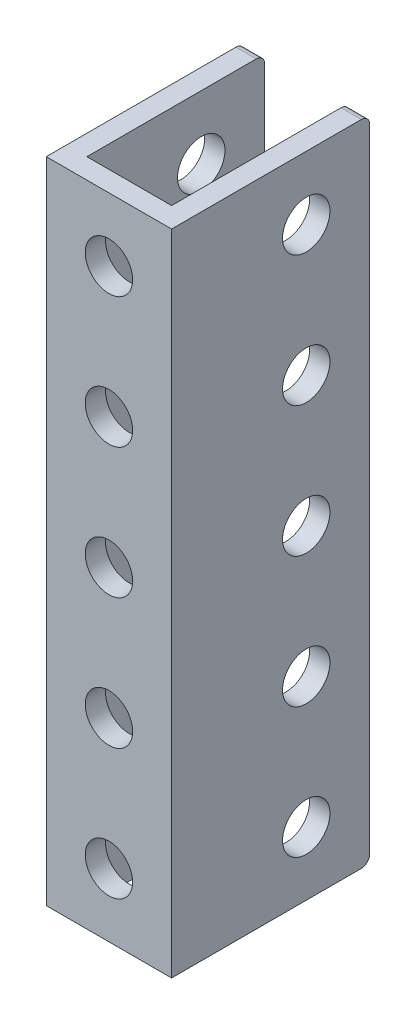
ISO-10303-21;
HEADER;
FILE_DESCRIPTION(('STEP AP214'),'2;1');
FILE_NAME('part.step','',(''),(''),'','','');
FILE_SCHEMA(('AUTOMOTIVE_DESIGN { 1 0 10303 214 1 1 1 1 }'));
ENDSEC;
DATA;
#1=APPLICATION_CONTEXT('core data for automotive mechanical design processes');
#2=APPLICATION_PROTOCOL_DEFINITION('international standard','automotive_design',2000,#1);
#3=PRODUCT_CONTEXT('',#1,'mechanical');
#4=PRODUCT('Part','Part','',(#3));
#5=PRODUCT_RELATED_PRODUCT_CATEGORY('part','',(#4));
#6=PRODUCT_DEFINITION_FORMATION('','',#4);
#7=PRODUCT_DEFINITION_CONTEXT('part definition',#1,'design');
#8=PRODUCT_DEFINITION('design','',#6,#7);
#9=PRODUCT_DEFINITION_SHAPE('','',#8);
#10=(LENGTH_UNIT() NAMED_UNIT(*) SI_UNIT(.MILLI.,.METRE.));
#11=(NAMED_UNIT(*) PLANE_ANGLE_UNIT() SI_UNIT($,.RADIAN.));
#12=(NAMED_UNIT(*) SI_UNIT($,.STERADIAN.) SOLID_ANGLE_UNIT());
#13=UNCERTAINTY_MEASURE_WITH_UNIT(LENGTH_MEASURE(1.E-05),#10,'distance_accuracy_value','');
#14=(GEOMETRIC_REPRESENTATION_CONTEXT(3) GLOBAL_UNCERTAINTY_ASSIGNED_CONTEXT((#13)) GLOBAL_UNIT_ASSIGNED_CONTEXT((#10,
#11,#12)) REPRESENTATION_CONTEXT('',''));
#15=CARTESIAN_POINT('',(0.,0.,0.));
#16=DIRECTION('',(0.,0.,1.));
#17=DIRECTION('',(1.,0.,0.));
#18=AXIS2_PLACEMENT_3D('',#15,#16,#17);
#19=CARTESIAN_POINT('',(4.699,48.641,-13.335));
#20=DIRECTION('',(0.,0.,-1.));
#21=DIRECTION('',(-1.,0.,0.));
#22=AXIS2_PLACEMENT_3D('',#19,#20,#21);
#23=PLANE('',#22);
#24=DIRECTION('',(0.,-1.,0.));
#25=VECTOR('',#24,1.);
#26=CARTESIAN_POINT('',(-4.699,48.641,-13.335));
#27=LINE('',#26,#25);
#28=CARTESIAN_POINT('',(-4.699,48.006,-13.335));
#29=VERTEX_POINT('',#28);
#30=CARTESIAN_POINT('',(-4.699,0.635000000000018,-13.335));
#31=VERTEX_POINT('',#30);
#32=EDGE_CURVE('E177',#29,#31,#27,.T.);
#33=ORIENTED_EDGE('',*,*,#32,.F.);
#34=DIRECTION('',(-1.,0.,0.));
#35=VECTOR('',#34,1.);
#36=CARTESIAN_POINT('',(4.699,48.006,-13.335));
#37=LINE('',#36,#35);
#38=CARTESIAN_POINT('',(-3.175,48.006,-13.335));
#39=VERTEX_POINT('',#38);
#40=EDGE_CURVE('E54',#29,#39,#37,.F.);
#41=ORIENTED_EDGE('',*,*,#40,.T.);
#42=DIRECTION('',(0.,-1.,0.));
#43=VECTOR('',#42,1.);
#44=CARTESIAN_POINT('',(-3.175,48.641,-13.335));
#45=LINE('',#44,#43);
#46=CARTESIAN_POINT('',(-3.175,0.635000000000018,-13.335));
#47=VERTEX_POINT('',#46);
#48=EDGE_CURVE('E149',#39,#47,#45,.T.);
#49=ORIENTED_EDGE('',*,*,#48,.T.);
#50=DIRECTION('',(-1.,0.,0.));
#51=VECTOR('',#50,1.);
#52=CARTESIAN_POINT('',(4.699,0.635000000000004,-13.335));
#53=LINE('',#52,#51);
#54=EDGE_CURVE('E213',#47,#31,#53,.T.);
#55=ORIENTED_EDGE('',*,*,#54,.T.);
#56=EDGE_LOOP('',(#33,#41,#49,#55));
#57=FACE_BOUND('',#56,.T.);
#58=ADVANCED_FACE('F33',(#57),#23,.T.);
#59=CARTESIAN_POINT('',(4.699,48.641,1.524));
#60=DIRECTION('',(0.,1.,0.));
#61=DIRECTION('',(0.,0.,1.));
#62=AXIS2_PLACEMENT_3D('',#59,#60,#61);
#63=PLANE('',#62);
#64=DIRECTION('',(0.,0.,-1.));
#65=VECTOR('',#64,1.);
#66=CARTESIAN_POINT('',(4.699,48.641,1.524));
#67=LINE('',#66,#65);
#68=CARTESIAN_POINT('',(4.699,48.641,1.524));
#69=VERTEX_POINT('',#68);
#70=CARTESIAN_POINT('',(4.699,48.641,-12.7));
#71=VERTEX_POINT('',#70);
#72=EDGE_CURVE('E163',#69,#71,#67,.T.);
#73=ORIENTED_EDGE('',*,*,#72,.T.);
#74=DIRECTION('',(-1.,0.,0.));
#75=VECTOR('',#74,1.);
#76=CARTESIAN_POINT('',(4.699,48.641,-12.7));
#77=LINE('',#76,#75);
#78=CARTESIAN_POINT('',(3.175,48.641,-12.7));
#79=VERTEX_POINT('',#78);
#80=EDGE_CURVE('E131',#71,#79,#77,.T.);
#81=ORIENTED_EDGE('',*,*,#80,.T.);
#82=DIRECTION('',(0.,0.,1.));
#83=VECTOR('',#82,1.);
#84=CARTESIAN_POINT('',(3.175,48.641,-13.335));
#85=LINE('',#84,#83);
#86=CARTESIAN_POINT('',(3.175,48.641,0.));
#87=VERTEX_POINT('',#86);
#88=EDGE_CURVE('E123',#79,#87,#85,.T.);
#89=ORIENTED_EDGE('',*,*,#88,.T.);
#90=DIRECTION('',(-1.,0.,0.));
#91=VECTOR('',#90,1.);
#92=CARTESIAN_POINT('',(3.175,48.641,0.));
#93=LINE('',#92,#91);
#94=CARTESIAN_POINT('',(-3.175,48.641,0.));
#95=VERTEX_POINT('',#94);
#96=EDGE_CURVE('E129',#87,#95,#93,.T.);
#97=ORIENTED_EDGE('',*,*,#96,.T.);
#98=DIRECTION('',(0.,0.,-1.));
#99=VECTOR('',#98,1.);
#100=CARTESIAN_POINT('',(-3.175,48.641,0.));
#101=LINE('',#100,#99);
#102=CARTESIAN_POINT('',(-3.175,48.641,-12.7));
#103=VERTEX_POINT('',#102);
#104=EDGE_CURVE('E133',#95,#103,#101,.T.);
#105=ORIENTED_EDGE('',*,*,#104,.T.);
#106=DIRECTION('',(-1.,0.,0.));
#107=VECTOR('',#106,1.);
#108=CARTESIAN_POINT('',(4.699,48.641,-12.7));
#109=LINE('',#108,#107);
#110=CARTESIAN_POINT('',(-4.699,48.641,-12.7));
#111=VERTEX_POINT('',#110);
#112=EDGE_CURVE('E205',#103,#111,#109,.T.);
#113=ORIENTED_EDGE('',*,*,#112,.T.);
#114=DIRECTION('',(0.,0.,-1.));
#115=VECTOR('',#114,1.);
#116=CARTESIAN_POINT('',(-4.699,48.641,1.524));
#117=LINE('',#116,#115);
#118=CARTESIAN_POINT('',(-4.699,48.641,1.524));
#119=VERTEX_POINT('',#118);
#120=EDGE_CURVE('E160',#119,#111,#117,.T.);
#121=ORIENTED_EDGE('',*,*,#120,.F.);
#122=DIRECTION('',(-1.,0.,0.));
#123=VECTOR('',#122,1.);
#124=CARTESIAN_POINT('',(4.699,48.641,1.524));
#125=LINE('',#124,#123);
#126=EDGE_CURVE('E184',#69,#119,#125,.T.);
#127=ORIENTED_EDGE('',*,*,#126,.F.);
#128=EDGE_LOOP('',(#73,#81,#89,#97,#105,#113,#121,#127));
#129=FACE_BOUND('',#128,.T.);
#130=ADVANCED_FACE('F126',(#129),#63,.T.);
#131=CARTESIAN_POINT('',(4.699,0.,1.524));
#132=DIRECTION('',(0.,0.,1.));
#133=DIRECTION('',(1.,0.,0.));
#134=AXIS2_PLACEMENT_3D('',#131,#132,#133);
#135=PLANE('',#134);
#136=CARTESIAN_POINT('',(0.,34.0995,1.524));
#137=DIRECTION('',(0.,0.,1.));
#138=DIRECTION('',(1.,0.,0.));
#139=AXIS2_PLACEMENT_3D('',#136,#137,#138);
#140=CIRCLE('',#139,1.77799999999998);
#141=CARTESIAN_POINT('',(1.77799999999998,34.0995,1.524));
#142=VERTEX_POINT('',#141);
#143=EDGE_CURVE('E283',#142,#142,#140,.T.);
#144=ORIENTED_EDGE('',*,*,#143,.F.);
#145=EDGE_LOOP('',(#144));
#146=FACE_BOUND('',#145,.T.);
#147=CARTESIAN_POINT('',(0.,43.8785,1.524));
#148=DIRECTION('',(0.,0.,1.));
#149=DIRECTION('',(1.,0.,0.));
#150=AXIS2_PLACEMENT_3D('',#147,#148,#149);
#151=CIRCLE('',#150,1.77799999999998);
#152=CARTESIAN_POINT('',(1.77799999999998,43.8785,1.524));
#153=VERTEX_POINT('',#152);
#154=EDGE_CURVE('E277',#153,#153,#151,.T.);
#155=ORIENTED_EDGE('',*,*,#154,.F.);
#156=EDGE_LOOP('',(#155));
#157=FACE_BOUND('',#156,.T.);
#158=CARTESIAN_POINT('',(0.,24.3205,1.524));
#159=DIRECTION('',(0.,0.,1.));
#160=DIRECTION('',(1.,0.,0.));
#161=AXIS2_PLACEMENT_3D('',#158,#159,#160);
#162=CIRCLE('',#161,1.77799999999998);
#163=CARTESIAN_POINT('',(1.77799999999998,24.3205,1.524));
#164=VERTEX_POINT('',#163);
#165=EDGE_CURVE('E271',#164,#164,#162,.T.);
#166=ORIENTED_EDGE('',*,*,#165,.F.);
#167=EDGE_LOOP('',(#166));
#168=FACE_BOUND('',#167,.T.);
#169=CARTESIAN_POINT('',(0.,14.5415,1.524));
#170=DIRECTION('',(0.,0.,1.));
#171=DIRECTION('',(1.,0.,0.));
#172=AXIS2_PLACEMENT_3D('',#169,#170,#171);
#173=CIRCLE('',#172,1.77799999999998);
#174=CARTESIAN_POINT('',(1.77799999999998,14.5415,1.524));
#175=VERTEX_POINT('',#174);
#176=EDGE_CURVE('E265',#175,#175,#173,.T.);
#177=ORIENTED_EDGE('',*,*,#176,.F.);
#178=EDGE_LOOP('',(#177));
#179=FACE_BOUND('',#178,.T.);
#180=CARTESIAN_POINT('',(0.,4.76249999999999,1.524));
#181=DIRECTION('',(0.,0.,1.));
#182=DIRECTION('',(1.,0.,0.));
#183=AXIS2_PLACEMENT_3D('',#180,#181,#182);
#184=CIRCLE('',#183,1.77799999999998);
#185=CARTESIAN_POINT('',(1.77799999999998,4.76249999999999,1.524));
#186=VERTEX_POINT('',#185);
#187=EDGE_CURVE('E259',#186,#186,#184,.T.);
#188=ORIENTED_EDGE('',*,*,#187,.F.);
#189=EDGE_LOOP('',(#188));
#190=FACE_BOUND('',#189,.T.);
#191=DIRECTION('',(0.,1.,0.));
#192=VECTOR('',#191,1.);
#193=CARTESIAN_POINT('',(-4.699,0.,1.524));
#194=LINE('',#193,#192);
#195=CARTESIAN_POINT('',(-4.699,0.,1.524));
#196=VERTEX_POINT('',#195);
#197=EDGE_CURVE('E166',#196,#119,#194,.T.);
#198=ORIENTED_EDGE('',*,*,#197,.F.);
#199=DIRECTION('',(-1.,0.,0.));
#200=VECTOR('',#199,1.);
#201=CARTESIAN_POINT('',(4.699,0.,1.524));
#202=LINE('',#201,#200);
#203=CARTESIAN_POINT('',(4.699,0.,1.524));
#204=VERTEX_POINT('',#203);
#205=EDGE_CURVE('E174',#204,#196,#202,.T.);
#206=ORIENTED_EDGE('',*,*,#205,.F.);
#207=DIRECTION('',(0.,1.,0.));
#208=VECTOR('',#207,1.);
#209=CARTESIAN_POINT('',(4.699,0.,1.524));
#210=LINE('',#209,#208);
#211=EDGE_CURVE('E171',#204,#69,#210,.T.);
#212=ORIENTED_EDGE('',*,*,#211,.T.);
#213=ORIENTED_EDGE('',*,*,#126,.T.);
#214=EDGE_LOOP('',(#198,#206,#212,#213));
#215=FACE_BOUND('',#214,.T.);
#216=ADVANCED_FACE('F354',(#146,#157,#168,#179,#190,#215),#135,.T.);
#217=CARTESIAN_POINT('',(4.699,0.,-13.335));
#218=DIRECTION('',(0.,-1.,0.));
#219=DIRECTION('',(0.,0.,-1.));
#220=AXIS2_PLACEMENT_3D('',#217,#218,#219);
#221=PLANE('',#220);
#222=DIRECTION('',(0.,0.,1.));
#223=VECTOR('',#222,1.);
#224=CARTESIAN_POINT('',(3.175,0.,-13.335));
#225=LINE('',#224,#223);
#226=CARTESIAN_POINT('',(3.175,0.,-12.7));
#227=VERTEX_POINT('',#226);
#228=CARTESIAN_POINT('',(3.175,0.,0.));
#229=VERTEX_POINT('',#228);
#230=EDGE_CURVE('E140',#227,#229,#225,.T.);
#231=ORIENTED_EDGE('',*,*,#230,.F.);
#232=DIRECTION('',(-1.,0.,0.));
#233=VECTOR('',#232,1.);
#234=CARTESIAN_POINT('',(4.699,0.,-12.7));
#235=LINE('',#234,#233);
#236=CARTESIAN_POINT('',(4.699,0.,-12.7));
#237=VERTEX_POINT('',#236);
#238=EDGE_CURVE('E199',#227,#237,#235,.F.);
#239=ORIENTED_EDGE('',*,*,#238,.T.);
#240=DIRECTION('',(0.,0.,1.));
#241=VECTOR('',#240,1.);
#242=CARTESIAN_POINT('',(4.699,0.,-13.335));
#243=LINE('',#242,#241);
#244=EDGE_CURVE('E169',#237,#204,#243,.T.);
#245=ORIENTED_EDGE('',*,*,#244,.T.);
#246=ORIENTED_EDGE('',*,*,#205,.T.);
#247=DIRECTION('',(0.,0.,1.));
#248=VECTOR('',#247,1.);
#249=CARTESIAN_POINT('',(-4.699,0.,-13.335));
#250=LINE('',#249,#248);
#251=CARTESIAN_POINT('',(-4.699,0.,-12.7));
#252=VERTEX_POINT('',#251);
#253=EDGE_CURVE('E180',#252,#196,#250,.T.);
#254=ORIENTED_EDGE('',*,*,#253,.F.);
#255=DIRECTION('',(-1.,0.,0.));
#256=VECTOR('',#255,1.);
#257=CARTESIAN_POINT('',(4.699,0.,-12.7));
#258=LINE('',#257,#256);
#259=CARTESIAN_POINT('',(-3.175,0.,-12.7));
#260=VERTEX_POINT('',#259);
#261=EDGE_CURVE('E197',#252,#260,#258,.F.);
#262=ORIENTED_EDGE('',*,*,#261,.T.);
#263=DIRECTION('',(0.,0.,-1.));
#264=VECTOR('',#263,1.);
#265=CARTESIAN_POINT('',(-3.175,0.,0.));
#266=LINE('',#265,#264);
#267=CARTESIAN_POINT('',(-3.175,0.,0.));
#268=VERTEX_POINT('',#267);
#269=EDGE_CURVE('E154',#268,#260,#266,.T.);
#270=ORIENTED_EDGE('',*,*,#269,.F.);
#271=DIRECTION('',(-1.,0.,0.));
#272=VECTOR('',#271,1.);
#273=CARTESIAN_POINT('',(3.175,0.,0.));
#274=LINE('',#273,#272);
#275=EDGE_CURVE('E158',#229,#268,#274,.T.);
#276=ORIENTED_EDGE('',*,*,#275,.F.);
#277=EDGE_LOOP('',(#231,#239,#245,#246,#254,#262,#270,#276));
#278=FACE_BOUND('',#277,.T.);
#279=ADVANCED_FACE('F359',(#278),#221,.T.);
#280=DIRECTION('',(0.,-1.,0.));
#281=VECTOR('',#280,1.);
#282=CARTESIAN_POINT('',(4.699,48.641,-13.335));
#283=LINE('',#282,#281);
#284=CARTESIAN_POINT('',(4.699,48.006,-13.335));
#285=VERTEX_POINT('',#284);
#286=CARTESIAN_POINT('',(4.699,0.635000000000018,-13.335));
#287=VERTEX_POINT('',#286);
#288=EDGE_CURVE('E165',#285,#287,#283,.T.);
#289=ORIENTED_EDGE('',*,*,#288,.T.);
#290=DIRECTION('',(-1.,0.,0.));
#291=VECTOR('',#290,1.);
#292=CARTESIAN_POINT('',(4.699,0.635000000000004,-13.335));
#293=LINE('',#292,#291);
#294=CARTESIAN_POINT('',(3.175,0.635000000000018,-13.335));
#295=VERTEX_POINT('',#294);
#296=EDGE_CURVE('E190',#287,#295,#293,.T.);
#297=ORIENTED_EDGE('',*,*,#296,.T.);
#298=DIRECTION('',(0.,-1.,0.));
#299=VECTOR('',#298,1.);
#300=CARTESIAN_POINT('',(3.175,48.641,-13.335));
#301=LINE('',#300,#299);
#302=CARTESIAN_POINT('',(3.175,48.006,-13.335));
#303=VERTEX_POINT('',#302);
#304=EDGE_CURVE('E145',#303,#295,#301,.T.);
#305=ORIENTED_EDGE('',*,*,#304,.F.);
#306=DIRECTION('',(-1.,0.,0.));
#307=VECTOR('',#306,1.);
#308=CARTESIAN_POINT('',(4.699,48.006,-13.335));
#309=LINE('',#308,#307);
#310=EDGE_CURVE('E186',#303,#285,#309,.F.);
#311=ORIENTED_EDGE('',*,*,#310,.T.);
#312=EDGE_LOOP('',(#289,#297,#305,#311));
#313=FACE_BOUND('',#312,.T.);
#314=ADVANCED_FACE('F350',(#313),#23,.T.);
#315=CARTESIAN_POINT('',(4.699,0.,0.));
#316=DIRECTION('',(-1.,0.,0.));
#317=DIRECTION('',(0.,0.,1.));
#318=AXIS2_PLACEMENT_3D('',#315,#316,#317);
#319=PLANE('',#318);
#320=CARTESIAN_POINT('',(4.699,34.0995,-8.5725));
#321=DIRECTION('',(1.,0.,0.));
#322=DIRECTION('',(0.,0.,-1.));
#323=AXIS2_PLACEMENT_3D('',#320,#321,#322);
#324=CIRCLE('',#323,1.77799999999998);
#325=CARTESIAN_POINT('',(4.699,34.0995,-10.3505));
#326=VERTEX_POINT('',#325);
#327=EDGE_CURVE('E253',#326,#326,#324,.T.);
#328=ORIENTED_EDGE('',*,*,#327,.F.);
#329=EDGE_LOOP('',(#328));
#330=FACE_BOUND('',#329,.T.);
#331=CARTESIAN_POINT('',(4.699,43.8785,-8.5725));
#332=DIRECTION('',(1.,0.,0.));
#333=DIRECTION('',(0.,0.,-1.));
#334=AXIS2_PLACEMENT_3D('',#331,#332,#333);
#335=CIRCLE('',#334,1.77799999999998);
#336=CARTESIAN_POINT('',(4.699,43.8785,-10.3505));
#337=VERTEX_POINT('',#336);
#338=EDGE_CURVE('E247',#337,#337,#335,.T.);
#339=ORIENTED_EDGE('',*,*,#338,.F.);
#340=EDGE_LOOP('',(#339));
#341=FACE_BOUND('',#340,.T.);
#342=CARTESIAN_POINT('',(4.699,24.3205,-8.5725));
#343=DIRECTION('',(1.,0.,0.));
#344=DIRECTION('',(0.,0.,-1.));
#345=AXIS2_PLACEMENT_3D('',#342,#343,#344);
#346=CIRCLE('',#345,1.77799999999998);
#347=CARTESIAN_POINT('',(4.699,24.3205,-10.3505));
#348=VERTEX_POINT('',#347);
#349=EDGE_CURVE('E241',#348,#348,#346,.T.);
#350=ORIENTED_EDGE('',*,*,#349,.F.);
#351=EDGE_LOOP('',(#350));
#352=FACE_BOUND('',#351,.T.);
#353=CARTESIAN_POINT('',(4.699,14.5415,-8.5725));
#354=DIRECTION('',(1.,0.,0.));
#355=DIRECTION('',(0.,0.,-1.));
#356=AXIS2_PLACEMENT_3D('',#353,#354,#355);
#357=CIRCLE('',#356,1.77799999999998);
#358=CARTESIAN_POINT('',(4.699,14.5415,-10.3505));
#359=VERTEX_POINT('',#358);
#360=EDGE_CURVE('E235',#359,#359,#357,.T.);
#361=ORIENTED_EDGE('',*,*,#360,.F.);
#362=EDGE_LOOP('',(#361));
#363=FACE_BOUND('',#362,.T.);
#364=CARTESIAN_POINT('',(4.699,4.76249999999999,-8.5725));
#365=DIRECTION('',(1.,0.,0.));
#366=DIRECTION('',(0.,0.,-1.));
#367=AXIS2_PLACEMENT_3D('',#364,#365,#366);
#368=CIRCLE('',#367,1.77799999999998);
#369=CARTESIAN_POINT('',(4.699,4.76249999999999,-10.3505));
#370=VERTEX_POINT('',#369);
#371=EDGE_CURVE('E229',#370,#370,#368,.T.);
#372=ORIENTED_EDGE('',*,*,#371,.F.);
#373=EDGE_LOOP('',(#372));
#374=FACE_BOUND('',#373,.T.);
#375=ORIENTED_EDGE('',*,*,#244,.F.);
#376=CARTESIAN_POINT('',(4.699,0.635000000000004,-12.7));
#377=DIRECTION('',(-1.,0.,0.));
#378=DIRECTION('',(0.,0.,1.));
#379=AXIS2_PLACEMENT_3D('',#376,#377,#378);
#380=CIRCLE('',#379,0.635);
#381=EDGE_CURVE('E203',#237,#287,#380,.F.);
#382=ORIENTED_EDGE('',*,*,#381,.T.);
#383=ORIENTED_EDGE('',*,*,#288,.F.);
#384=CARTESIAN_POINT('',(4.699,48.006,-12.7));
#385=DIRECTION('',(-1.,0.,0.));
#386=DIRECTION('',(0.,0.,1.));
#387=AXIS2_PLACEMENT_3D('',#384,#385,#386);
#388=CIRCLE('',#387,0.635);
#389=EDGE_CURVE('E201',#285,#71,#388,.F.);
#390=ORIENTED_EDGE('',*,*,#389,.T.);
#391=ORIENTED_EDGE('',*,*,#72,.F.);
#392=ORIENTED_EDGE('',*,*,#211,.F.);
#393=EDGE_LOOP('',(#375,#382,#383,#390,#391,#392));
#394=FACE_BOUND('',#393,.T.);
#395=ADVANCED_FACE('F358',(#330,#341,#352,#363,#374,#394),#319,.F.);
#396=CARTESIAN_POINT('',(-4.699,0.,0.));
#397=DIRECTION('',(-1.,0.,0.));
#398=DIRECTION('',(0.,0.,1.));
#399=AXIS2_PLACEMENT_3D('',#396,#397,#398);
#400=PLANE('',#399);
#401=CARTESIAN_POINT('',(-4.69900000000001,34.0995,-8.5725));
#402=DIRECTION('',(1.,0.,0.));
#403=DIRECTION('',(0.,0.,-1.));
#404=AXIS2_PLACEMENT_3D('',#401,#402,#403);
#405=CIRCLE('',#404,1.77799999999998);
#406=CARTESIAN_POINT('',(-4.69900000000001,34.0995,-10.3505));
#407=VERTEX_POINT('',#406);
#408=EDGE_CURVE('E310',#407,#407,#405,.T.);
#409=ORIENTED_EDGE('',*,*,#408,.T.);
#410=EDGE_LOOP('',(#409));
#411=FACE_BOUND('',#410,.T.);
#412=CARTESIAN_POINT('',(-4.69900000000001,43.8785,-8.5725));
#413=DIRECTION('',(1.,0.,0.));
#414=DIRECTION('',(0.,0.,-1.));
#415=AXIS2_PLACEMENT_3D('',#412,#413,#414);
#416=CIRCLE('',#415,1.77799999999998);
#417=CARTESIAN_POINT('',(-4.69900000000001,43.8785,-10.3505));
#418=VERTEX_POINT('',#417);
#419=EDGE_CURVE('E304',#418,#418,#416,.T.);
#420=ORIENTED_EDGE('',*,*,#419,.T.);
#421=EDGE_LOOP('',(#420));
#422=FACE_BOUND('',#421,.T.);
#423=CARTESIAN_POINT('',(-4.69900000000001,24.3205,-8.5725));
#424=DIRECTION('',(1.,0.,0.));
#425=DIRECTION('',(0.,0.,-1.));
#426=AXIS2_PLACEMENT_3D('',#423,#424,#425);
#427=CIRCLE('',#426,1.77799999999998);
#428=CARTESIAN_POINT('',(-4.69900000000001,24.3205,-10.3505));
#429=VERTEX_POINT('',#428);
#430=EDGE_CURVE('E298',#429,#429,#427,.T.);
#431=ORIENTED_EDGE('',*,*,#430,.T.);
#432=EDGE_LOOP('',(#431));
#433=FACE_BOUND('',#432,.T.);
#434=CARTESIAN_POINT('',(-4.69900000000001,14.5415,-8.5725));
#435=DIRECTION('',(1.,0.,0.));
#436=DIRECTION('',(0.,0.,-1.));
#437=AXIS2_PLACEMENT_3D('',#434,#435,#436);
#438=CIRCLE('',#437,1.77799999999998);
#439=CARTESIAN_POINT('',(-4.69900000000001,14.5415,-10.3505));
#440=VERTEX_POINT('',#439);
#441=EDGE_CURVE('E292',#440,#440,#438,.T.);
#442=ORIENTED_EDGE('',*,*,#441,.T.);
#443=EDGE_LOOP('',(#442));
#444=FACE_BOUND('',#443,.T.);
#445=CARTESIAN_POINT('',(-4.69900000000001,4.76249999999999,-8.5725));
#446=DIRECTION('',(1.,0.,0.));
#447=DIRECTION('',(0.,0.,-1.));
#448=AXIS2_PLACEMENT_3D('',#445,#446,#447);
#449=CIRCLE('',#448,1.77799999999998);
#450=CARTESIAN_POINT('',(-4.69900000000001,4.76249999999999,-10.3505));
#451=VERTEX_POINT('',#450);
#452=EDGE_CURVE('E286',#451,#451,#449,.T.);
#453=ORIENTED_EDGE('',*,*,#452,.T.);
#454=EDGE_LOOP('',(#453));
#455=FACE_BOUND('',#454,.T.);
#456=ORIENTED_EDGE('',*,*,#120,.T.);
#457=CARTESIAN_POINT('',(-4.699,48.006,-12.7));
#458=DIRECTION('',(-1.,0.,0.));
#459=DIRECTION('',(0.,0.,1.));
#460=AXIS2_PLACEMENT_3D('',#457,#458,#459);
#461=CIRCLE('',#460,0.635);
#462=EDGE_CURVE('E211',#111,#29,#461,.T.);
#463=ORIENTED_EDGE('',*,*,#462,.T.);
#464=ORIENTED_EDGE('',*,*,#32,.T.);
#465=CARTESIAN_POINT('',(-4.699,0.635000000000004,-12.7));
#466=DIRECTION('',(-1.,0.,0.));
#467=DIRECTION('',(0.,0.,1.));
#468=AXIS2_PLACEMENT_3D('',#465,#466,#467);
#469=CIRCLE('',#468,0.635);
#470=EDGE_CURVE('E209',#31,#252,#469,.T.);
#471=ORIENTED_EDGE('',*,*,#470,.T.);
#472=ORIENTED_EDGE('',*,*,#253,.T.);
#473=ORIENTED_EDGE('',*,*,#197,.T.);
#474=EDGE_LOOP('',(#456,#463,#464,#471,#472,#473));
#475=FACE_BOUND('',#474,.T.);
#476=ADVANCED_FACE('F219',(#411,#422,#433,#444,#455,#475),#400,.T.);
#477=CARTESIAN_POINT('',(-3.175,48.641,0.));
#478=DIRECTION('',(-1.,0.,0.));
#479=DIRECTION('',(0.,0.,1.));
#480=AXIS2_PLACEMENT_3D('',#477,#478,#479);
#481=PLANE('',#480);
#482=CARTESIAN_POINT('',(-3.175,34.0995,-8.5725));
#483=DIRECTION('',(1.,0.,0.));
#484=DIRECTION('',(0.,0.,-1.));
#485=AXIS2_PLACEMENT_3D('',#482,#483,#484);
#486=CIRCLE('',#485,1.77799999999998);
#487=CARTESIAN_POINT('',(-3.175,34.0995,-10.3505));
#488=VERTEX_POINT('',#487);
#489=EDGE_CURVE('E313',#488,#488,#486,.T.);
#490=ORIENTED_EDGE('',*,*,#489,.F.);
#491=EDGE_LOOP('',(#490));
#492=FACE_BOUND('',#491,.T.);
#493=CARTESIAN_POINT('',(-3.175,43.8785,-8.5725));
#494=DIRECTION('',(1.,0.,0.));
#495=DIRECTION('',(0.,0.,-1.));
#496=AXIS2_PLACEMENT_3D('',#493,#494,#495);
#497=CIRCLE('',#496,1.77799999999998);
#498=CARTESIAN_POINT('',(-3.175,43.8785,-10.3505));
#499=VERTEX_POINT('',#498);
#500=EDGE_CURVE('E307',#499,#499,#497,.T.);
#501=ORIENTED_EDGE('',*,*,#500,.F.);
#502=EDGE_LOOP('',(#501));
#503=FACE_BOUND('',#502,.T.);
#504=CARTESIAN_POINT('',(-3.175,24.3205,-8.5725));
#505=DIRECTION('',(1.,0.,0.));
#506=DIRECTION('',(0.,0.,-1.));
#507=AXIS2_PLACEMENT_3D('',#504,#505,#506);
#508=CIRCLE('',#507,1.77799999999998);
#509=CARTESIAN_POINT('',(-3.175,24.3205,-10.3505));
#510=VERTEX_POINT('',#509);
#511=EDGE_CURVE('E301',#510,#510,#508,.T.);
#512=ORIENTED_EDGE('',*,*,#511,.F.);
#513=EDGE_LOOP('',(#512));
#514=FACE_BOUND('',#513,.T.);
#515=CARTESIAN_POINT('',(-3.175,14.5415,-8.5725));
#516=DIRECTION('',(1.,0.,0.));
#517=DIRECTION('',(0.,0.,-1.));
#518=AXIS2_PLACEMENT_3D('',#515,#516,#517);
#519=CIRCLE('',#518,1.77799999999998);
#520=CARTESIAN_POINT('',(-3.175,14.5415,-10.3505));
#521=VERTEX_POINT('',#520);
#522=EDGE_CURVE('E295',#521,#521,#519,.T.);
#523=ORIENTED_EDGE('',*,*,#522,.F.);
#524=EDGE_LOOP('',(#523));
#525=FACE_BOUND('',#524,.T.);
#526=CARTESIAN_POINT('',(-3.175,4.76249999999999,-8.5725));
#527=DIRECTION('',(1.,0.,0.));
#528=DIRECTION('',(0.,0.,-1.));
#529=AXIS2_PLACEMENT_3D('',#526,#527,#528);
#530=CIRCLE('',#529,1.77799999999998);
#531=CARTESIAN_POINT('',(-3.175,4.76249999999999,-10.3505));
#532=VERTEX_POINT('',#531);
#533=EDGE_CURVE('E289',#532,#532,#530,.T.);
#534=ORIENTED_EDGE('',*,*,#533,.F.);
#535=EDGE_LOOP('',(#534));
#536=FACE_BOUND('',#535,.T.);
#537=ORIENTED_EDGE('',*,*,#48,.F.);
#538=CARTESIAN_POINT('',(-3.175,48.006,-12.7));
#539=DIRECTION('',(-1.,0.,0.));
#540=DIRECTION('',(0.,0.,1.));
#541=AXIS2_PLACEMENT_3D('',#538,#539,#540);
#542=CIRCLE('',#541,0.635);
#543=EDGE_CURVE('E11',#39,#103,#542,.F.);
#544=ORIENTED_EDGE('',*,*,#543,.T.);
#545=ORIENTED_EDGE('',*,*,#104,.F.);
#546=DIRECTION('',(0.,-1.,0.));
#547=VECTOR('',#546,1.);
#548=CARTESIAN_POINT('',(-3.175,48.641,0.));
#549=LINE('',#548,#547);
#550=EDGE_CURVE('E144',#95,#268,#549,.T.);
#551=ORIENTED_EDGE('',*,*,#550,.T.);
#552=ORIENTED_EDGE('',*,*,#269,.T.);
#553=CARTESIAN_POINT('',(-3.175,0.635000000000004,-12.7));
#554=DIRECTION('',(-1.,0.,0.));
#555=DIRECTION('',(0.,0.,1.));
#556=AXIS2_PLACEMENT_3D('',#553,#554,#555);
#557=CIRCLE('',#556,0.635);
#558=EDGE_CURVE('E41',#260,#47,#557,.F.);
#559=ORIENTED_EDGE('',*,*,#558,.T.);
#560=EDGE_LOOP('',(#537,#544,#545,#551,#552,#559));
#561=FACE_BOUND('',#560,.T.);
#562=ADVANCED_FACE('F319',(#492,#503,#514,#525,#536,#561),#481,.F.);
#563=CARTESIAN_POINT('',(3.175,48.641,0.));
#564=DIRECTION('',(0.,0.,1.));
#565=DIRECTION('',(1.,0.,0.));
#566=AXIS2_PLACEMENT_3D('',#563,#564,#565);
#567=PLANE('',#566);
#568=CARTESIAN_POINT('',(0.,34.0995,0.));
#569=DIRECTION('',(0.,0.,1.));
#570=DIRECTION('',(1.,0.,0.));
#571=AXIS2_PLACEMENT_3D('',#568,#569,#570);
#572=CIRCLE('',#571,1.77799999999998);
#573=CARTESIAN_POINT('',(1.77799999999998,34.0995,0.));
#574=VERTEX_POINT('',#573);
#575=EDGE_CURVE('E280',#574,#574,#572,.T.);
#576=ORIENTED_EDGE('',*,*,#575,.T.);
#577=EDGE_LOOP('',(#576));
#578=FACE_BOUND('',#577,.T.);
#579=CARTESIAN_POINT('',(0.,43.8785,0.));
#580=DIRECTION('',(0.,0.,1.));
#581=DIRECTION('',(1.,0.,0.));
#582=AXIS2_PLACEMENT_3D('',#579,#580,#581);
#583=CIRCLE('',#582,1.77799999999998);
#584=CARTESIAN_POINT('',(1.77799999999998,43.8785,0.));
#585=VERTEX_POINT('',#584);
#586=EDGE_CURVE('E274',#585,#585,#583,.T.);
#587=ORIENTED_EDGE('',*,*,#586,.T.);
#588=EDGE_LOOP('',(#587));
#589=FACE_BOUND('',#588,.T.);
#590=CARTESIAN_POINT('',(0.,24.3205,0.));
#591=DIRECTION('',(0.,0.,1.));
#592=DIRECTION('',(1.,0.,0.));
#593=AXIS2_PLACEMENT_3D('',#590,#591,#592);
#594=CIRCLE('',#593,1.77799999999998);
#595=CARTESIAN_POINT('',(1.77799999999998,24.3205,0.));
#596=VERTEX_POINT('',#595);
#597=EDGE_CURVE('E268',#596,#596,#594,.T.);
#598=ORIENTED_EDGE('',*,*,#597,.T.);
#599=EDGE_LOOP('',(#598));
#600=FACE_BOUND('',#599,.T.);
#601=CARTESIAN_POINT('',(0.,14.5415,0.));
#602=DIRECTION('',(0.,0.,1.));
#603=DIRECTION('',(1.,0.,0.));
#604=AXIS2_PLACEMENT_3D('',#601,#602,#603);
#605=CIRCLE('',#604,1.77799999999998);
#606=CARTESIAN_POINT('',(1.77799999999998,14.5415,0.));
#607=VERTEX_POINT('',#606);
#608=EDGE_CURVE('E262',#607,#607,#605,.T.);
#609=ORIENTED_EDGE('',*,*,#608,.T.);
#610=EDGE_LOOP('',(#609));
#611=FACE_BOUND('',#610,.T.);
#612=CARTESIAN_POINT('',(0.,4.76249999999999,0.));
#613=DIRECTION('',(0.,0.,1.));
#614=DIRECTION('',(1.,0.,0.));
#615=AXIS2_PLACEMENT_3D('',#612,#613,#614);
#616=CIRCLE('',#615,1.77799999999998);
#617=CARTESIAN_POINT('',(1.77799999999998,4.76249999999999,0.));
#618=VERTEX_POINT('',#617);
#619=EDGE_CURVE('E256',#618,#618,#616,.T.);
#620=ORIENTED_EDGE('',*,*,#619,.T.);
#621=EDGE_LOOP('',(#620));
#622=FACE_BOUND('',#621,.T.);
#623=ORIENTED_EDGE('',*,*,#275,.T.);
#624=ORIENTED_EDGE('',*,*,#550,.F.);
#625=ORIENTED_EDGE('',*,*,#96,.F.);
#626=DIRECTION('',(0.,-1.,0.));
#627=VECTOR('',#626,1.);
#628=CARTESIAN_POINT('',(3.175,48.641,0.));
#629=LINE('',#628,#627);
#630=EDGE_CURVE('E136',#87,#229,#629,.T.);
#631=ORIENTED_EDGE('',*,*,#630,.T.);
#632=EDGE_LOOP('',(#623,#624,#625,#631));
#633=FACE_BOUND('',#632,.T.);
#634=ADVANCED_FACE('F147',(#578,#589,#600,#611,#622,#633),#567,.F.);
#635=CARTESIAN_POINT('',(3.175,48.641,-13.335));
#636=DIRECTION('',(1.,0.,0.));
#637=DIRECTION('',(0.,0.,-1.));
#638=AXIS2_PLACEMENT_3D('',#635,#636,#637);
#639=PLANE('',#638);
#640=CARTESIAN_POINT('',(3.175,34.0995,-8.5725));
#641=DIRECTION('',(1.,0.,0.));
#642=DIRECTION('',(0.,0.,-1.));
#643=AXIS2_PLACEMENT_3D('',#640,#641,#642);
#644=CIRCLE('',#643,1.77799999999998);
#645=CARTESIAN_POINT('',(3.175,34.0995,-10.3505));
#646=VERTEX_POINT('',#645);
#647=EDGE_CURVE('E250',#646,#646,#644,.T.);
#648=ORIENTED_EDGE('',*,*,#647,.T.);
#649=EDGE_LOOP('',(#648));
#650=FACE_BOUND('',#649,.T.);
#651=CARTESIAN_POINT('',(3.175,43.8785,-8.5725));
#652=DIRECTION('',(1.,0.,0.));
#653=DIRECTION('',(0.,0.,-1.));
#654=AXIS2_PLACEMENT_3D('',#651,#652,#653);
#655=CIRCLE('',#654,1.77799999999998);
#656=CARTESIAN_POINT('',(3.175,43.8785,-10.3505));
#657=VERTEX_POINT('',#656);
#658=EDGE_CURVE('E244',#657,#657,#655,.T.);
#659=ORIENTED_EDGE('',*,*,#658,.T.);
#660=EDGE_LOOP('',(#659));
#661=FACE_BOUND('',#660,.T.);
#662=CARTESIAN_POINT('',(3.175,24.3205,-8.5725));
#663=DIRECTION('',(1.,0.,0.));
#664=DIRECTION('',(0.,0.,-1.));
#665=AXIS2_PLACEMENT_3D('',#662,#663,#664);
#666=CIRCLE('',#665,1.77799999999998);
#667=CARTESIAN_POINT('',(3.175,24.3205,-10.3505));
#668=VERTEX_POINT('',#667);
#669=EDGE_CURVE('E238',#668,#668,#666,.T.);
#670=ORIENTED_EDGE('',*,*,#669,.T.);
#671=EDGE_LOOP('',(#670));
#672=FACE_BOUND('',#671,.T.);
#673=CARTESIAN_POINT('',(3.175,14.5415,-8.5725));
#674=DIRECTION('',(1.,0.,0.));
#675=DIRECTION('',(0.,0.,-1.));
#676=AXIS2_PLACEMENT_3D('',#673,#674,#675);
#677=CIRCLE('',#676,1.77799999999999);
#678=CARTESIAN_POINT('',(3.175,14.5415,-10.3505));
#679=VERTEX_POINT('',#678);
#680=EDGE_CURVE('E232',#679,#679,#677,.T.);
#681=ORIENTED_EDGE('',*,*,#680,.T.);
#682=EDGE_LOOP('',(#681));
#683=FACE_BOUND('',#682,.T.);
#684=CARTESIAN_POINT('',(3.175,4.76249999999999,-8.5725));
#685=DIRECTION('',(1.,0.,0.));
#686=DIRECTION('',(0.,0.,-1.));
#687=AXIS2_PLACEMENT_3D('',#684,#685,#686);
#688=CIRCLE('',#687,1.77799999999999);
#689=CARTESIAN_POINT('',(3.175,4.76249999999999,-10.3505));
#690=VERTEX_POINT('',#689);
#691=EDGE_CURVE('E156',#690,#690,#688,.T.);
#692=ORIENTED_EDGE('',*,*,#691,.T.);
#693=EDGE_LOOP('',(#692));
#694=FACE_BOUND('',#693,.T.);
#695=ORIENTED_EDGE('',*,*,#304,.T.);
#696=CARTESIAN_POINT('',(3.175,0.635000000000004,-12.7));
#697=DIRECTION('',(1.,0.,0.));
#698=DIRECTION('',(0.,0.,-1.));
#699=AXIS2_PLACEMENT_3D('',#696,#697,#698);
#700=CIRCLE('',#699,0.635);
#701=EDGE_CURVE('E195',#295,#227,#700,.F.);
#702=ORIENTED_EDGE('',*,*,#701,.T.);
#703=ORIENTED_EDGE('',*,*,#230,.T.);
#704=ORIENTED_EDGE('',*,*,#630,.F.);
#705=ORIENTED_EDGE('',*,*,#88,.F.);
#706=CARTESIAN_POINT('',(3.175,48.006,-12.7));
#707=DIRECTION('',(1.,0.,0.));
#708=DIRECTION('',(0.,0.,-1.));
#709=AXIS2_PLACEMENT_3D('',#706,#707,#708);
#710=CIRCLE('',#709,0.635);
#711=EDGE_CURVE('E193',#79,#303,#710,.F.);
#712=ORIENTED_EDGE('',*,*,#711,.T.);
#713=EDGE_LOOP('',(#695,#702,#703,#704,#705,#712));
#714=FACE_BOUND('',#713,.T.);
#715=ADVANCED_FACE('F138',(#650,#661,#672,#683,#694,#714),#639,.F.);
#716=CARTESIAN_POINT('',(4.699,4.76249999999999,-8.5725));
#717=DIRECTION('',(1.,0.,0.));
#718=DIRECTION('',(0.,0.,-1.));
#719=AXIS2_PLACEMENT_3D('',#716,#717,#718);
#720=CYLINDRICAL_SURFACE('',#719,1.77799999999999);
#721=ORIENTED_EDGE('',*,*,#691,.F.);
#722=EDGE_LOOP('',(#721));
#723=FACE_BOUND('',#722,.T.);
#724=ORIENTED_EDGE('',*,*,#371,.T.);
#725=EDGE_LOOP('',(#724));
#726=FACE_BOUND('',#725,.T.);
#727=ADVANCED_FACE('F457',(#723,#726),#720,.F.);
#728=CARTESIAN_POINT('',(4.699,14.5415,-8.5725));
#729=DIRECTION('',(1.,0.,0.));
#730=DIRECTION('',(0.,0.,-1.));
#731=AXIS2_PLACEMENT_3D('',#728,#729,#730);
#732=CYLINDRICAL_SURFACE('',#731,1.77799999999999);
#733=ORIENTED_EDGE('',*,*,#680,.F.);
#734=EDGE_LOOP('',(#733));
#735=FACE_BOUND('',#734,.T.);
#736=ORIENTED_EDGE('',*,*,#360,.T.);
#737=EDGE_LOOP('',(#736));
#738=FACE_BOUND('',#737,.T.);
#739=ADVANCED_FACE('F464',(#735,#738),#732,.F.);
#740=CARTESIAN_POINT('',(4.699,24.3205,-8.5725));
#741=DIRECTION('',(1.,0.,0.));
#742=DIRECTION('',(0.,0.,-1.));
#743=AXIS2_PLACEMENT_3D('',#740,#741,#742);
#744=CYLINDRICAL_SURFACE('',#743,1.77799999999998);
#745=ORIENTED_EDGE('',*,*,#669,.F.);
#746=EDGE_LOOP('',(#745));
#747=FACE_BOUND('',#746,.T.);
#748=ORIENTED_EDGE('',*,*,#349,.T.);
#749=EDGE_LOOP('',(#748));
#750=FACE_BOUND('',#749,.T.);
#751=ADVANCED_FACE('F468',(#747,#750),#744,.F.);
#752=CARTESIAN_POINT('',(4.699,43.8785,-8.5725));
#753=DIRECTION('',(1.,0.,0.));
#754=DIRECTION('',(0.,0.,-1.));
#755=AXIS2_PLACEMENT_3D('',#752,#753,#754);
#756=CYLINDRICAL_SURFACE('',#755,1.77799999999998);
#757=ORIENTED_EDGE('',*,*,#658,.F.);
#758=EDGE_LOOP('',(#757));
#759=FACE_BOUND('',#758,.T.);
#760=ORIENTED_EDGE('',*,*,#338,.T.);
#761=EDGE_LOOP('',(#760));
#762=FACE_BOUND('',#761,.T.);
#763=ADVANCED_FACE('F472',(#759,#762),#756,.F.);
#764=CARTESIAN_POINT('',(4.699,34.0995,-8.5725));
#765=DIRECTION('',(1.,0.,0.));
#766=DIRECTION('',(0.,0.,-1.));
#767=AXIS2_PLACEMENT_3D('',#764,#765,#766);
#768=CYLINDRICAL_SURFACE('',#767,1.77799999999998);
#769=ORIENTED_EDGE('',*,*,#647,.F.);
#770=EDGE_LOOP('',(#769));
#771=FACE_BOUND('',#770,.T.);
#772=ORIENTED_EDGE('',*,*,#327,.T.);
#773=EDGE_LOOP('',(#772));
#774=FACE_BOUND('',#773,.T.);
#775=ADVANCED_FACE('F447',(#771,#774),#768,.F.);
#776=CARTESIAN_POINT('',(0.,4.76249999999999,1.524));
#777=DIRECTION('',(0.,0.,1.));
#778=DIRECTION('',(1.,0.,0.));
#779=AXIS2_PLACEMENT_3D('',#776,#777,#778);
#780=CYLINDRICAL_SURFACE('',#779,1.77799999999998);
#781=ORIENTED_EDGE('',*,*,#187,.T.);
#782=EDGE_LOOP('',(#781));
#783=FACE_BOUND('',#782,.T.);
#784=ORIENTED_EDGE('',*,*,#619,.F.);
#785=EDGE_LOOP('',(#784));
#786=FACE_BOUND('',#785,.T.);
#787=ADVANCED_FACE('F443',(#783,#786),#780,.F.);
#788=CARTESIAN_POINT('',(0.,14.5415,1.524));
#789=DIRECTION('',(0.,0.,1.));
#790=DIRECTION('',(1.,0.,0.));
#791=AXIS2_PLACEMENT_3D('',#788,#789,#790);
#792=CYLINDRICAL_SURFACE('',#791,1.77799999999998);
#793=ORIENTED_EDGE('',*,*,#176,.T.);
#794=EDGE_LOOP('',(#793));
#795=FACE_BOUND('',#794,.T.);
#796=ORIENTED_EDGE('',*,*,#608,.F.);
#797=EDGE_LOOP('',(#796));
#798=FACE_BOUND('',#797,.T.);
#799=ADVANCED_FACE('F446',(#795,#798),#792,.F.);
#800=CARTESIAN_POINT('',(0.,24.3205,1.524));
#801=DIRECTION('',(0.,0.,1.));
#802=DIRECTION('',(1.,0.,0.));
#803=AXIS2_PLACEMENT_3D('',#800,#801,#802);
#804=CYLINDRICAL_SURFACE('',#803,1.77799999999998);
#805=ORIENTED_EDGE('',*,*,#165,.T.);
#806=EDGE_LOOP('',(#805));
#807=FACE_BOUND('',#806,.T.);
#808=ORIENTED_EDGE('',*,*,#597,.F.);
#809=EDGE_LOOP('',(#808));
#810=FACE_BOUND('',#809,.T.);
#811=ADVANCED_FACE('F482',(#807,#810),#804,.F.);
#812=CARTESIAN_POINT('',(0.,43.8785,1.524));
#813=DIRECTION('',(0.,0.,1.));
#814=DIRECTION('',(1.,0.,0.));
#815=AXIS2_PLACEMENT_3D('',#812,#813,#814);
#816=CYLINDRICAL_SURFACE('',#815,1.77799999999998);
#817=ORIENTED_EDGE('',*,*,#154,.T.);
#818=EDGE_LOOP('',(#817));
#819=FACE_BOUND('',#818,.T.);
#820=ORIENTED_EDGE('',*,*,#586,.F.);
#821=EDGE_LOOP('',(#820));
#822=FACE_BOUND('',#821,.T.);
#823=ADVANCED_FACE('F344',(#819,#822),#816,.F.);
#824=CARTESIAN_POINT('',(0.,34.0995,1.524));
#825=DIRECTION('',(0.,0.,1.));
#826=DIRECTION('',(1.,0.,0.));
#827=AXIS2_PLACEMENT_3D('',#824,#825,#826);
#828=CYLINDRICAL_SURFACE('',#827,1.77799999999998);
#829=ORIENTED_EDGE('',*,*,#143,.T.);
#830=EDGE_LOOP('',(#829));
#831=FACE_BOUND('',#830,.T.);
#832=ORIENTED_EDGE('',*,*,#575,.F.);
#833=EDGE_LOOP('',(#832));
#834=FACE_BOUND('',#833,.T.);
#835=ADVANCED_FACE('F334',(#831,#834),#828,.F.);
#836=CARTESIAN_POINT('',(-3.175,4.76249999999999,-8.5725));
#837=DIRECTION('',(1.,0.,0.));
#838=DIRECTION('',(0.,0.,-1.));
#839=AXIS2_PLACEMENT_3D('',#836,#837,#838);
#840=CYLINDRICAL_SURFACE('',#839,1.77799999999998);
#841=ORIENTED_EDGE('',*,*,#452,.F.);
#842=EDGE_LOOP('',(#841));
#843=FACE_BOUND('',#842,.T.);
#844=ORIENTED_EDGE('',*,*,#533,.T.);
#845=EDGE_LOOP('',(#844));
#846=FACE_BOUND('',#845,.T.);
#847=ADVANCED_FACE('F331',(#843,#846),#840,.F.);
#848=CARTESIAN_POINT('',(-3.175,14.5415,-8.5725));
#849=DIRECTION('',(1.,0.,0.));
#850=DIRECTION('',(0.,0.,-1.));
#851=AXIS2_PLACEMENT_3D('',#848,#849,#850);
#852=CYLINDRICAL_SURFACE('',#851,1.77799999999998);
#853=ORIENTED_EDGE('',*,*,#441,.F.);
#854=EDGE_LOOP('',(#853));
#855=FACE_BOUND('',#854,.T.);
#856=ORIENTED_EDGE('',*,*,#522,.T.);
#857=EDGE_LOOP('',(#856));
#858=FACE_BOUND('',#857,.T.);
#859=ADVANCED_FACE('F333',(#855,#858),#852,.F.);
#860=CARTESIAN_POINT('',(-3.175,24.3205,-8.5725));
#861=DIRECTION('',(1.,0.,0.));
#862=DIRECTION('',(0.,0.,-1.));
#863=AXIS2_PLACEMENT_3D('',#860,#861,#862);
#864=CYLINDRICAL_SURFACE('',#863,1.77799999999998);
#865=ORIENTED_EDGE('',*,*,#430,.F.);
#866=EDGE_LOOP('',(#865));
#867=FACE_BOUND('',#866,.T.);
#868=ORIENTED_EDGE('',*,*,#511,.T.);
#869=EDGE_LOOP('',(#868));
#870=FACE_BOUND('',#869,.T.);
#871=ADVANCED_FACE('F341',(#867,#870),#864,.F.);
#872=CARTESIAN_POINT('',(-3.175,43.8785,-8.5725));
#873=DIRECTION('',(1.,0.,0.));
#874=DIRECTION('',(0.,0.,-1.));
#875=AXIS2_PLACEMENT_3D('',#872,#873,#874);
#876=CYLINDRICAL_SURFACE('',#875,1.77799999999998);
#877=ORIENTED_EDGE('',*,*,#419,.F.);
#878=EDGE_LOOP('',(#877));
#879=FACE_BOUND('',#878,.T.);
#880=ORIENTED_EDGE('',*,*,#500,.T.);
#881=EDGE_LOOP('',(#880));
#882=FACE_BOUND('',#881,.T.);
#883=ADVANCED_FACE('F396',(#879,#882),#876,.F.);
#884=CARTESIAN_POINT('',(-3.175,34.0995,-8.5725));
#885=DIRECTION('',(1.,0.,0.));
#886=DIRECTION('',(0.,0.,-1.));
#887=AXIS2_PLACEMENT_3D('',#884,#885,#886);
#888=CYLINDRICAL_SURFACE('',#887,1.77799999999998);
#889=ORIENTED_EDGE('',*,*,#408,.F.);
#890=EDGE_LOOP('',(#889));
#891=FACE_BOUND('',#890,.T.);
#892=ORIENTED_EDGE('',*,*,#489,.T.);
#893=EDGE_LOOP('',(#892));
#894=FACE_BOUND('',#893,.T.);
#895=ADVANCED_FACE('F317',(#891,#894),#888,.F.);
#896=CARTESIAN_POINT('',(4.699,0.635000000000004,-12.7));
#897=DIRECTION('',(-1.,0.,0.));
#898=DIRECTION('',(0.,0.,1.));
#899=AXIS2_PLACEMENT_3D('',#896,#897,#898);
#900=CYLINDRICAL_SURFACE('',#899,0.635);
#901=ORIENTED_EDGE('',*,*,#381,.F.);
#902=ORIENTED_EDGE('',*,*,#238,.F.);
#903=ORIENTED_EDGE('',*,*,#701,.F.);
#904=ORIENTED_EDGE('',*,*,#296,.F.);
#905=EDGE_LOOP('',(#901,#902,#903,#904));
#906=FACE_BOUND('',#905,.T.);
#907=ADVANCED_FACE('F376',(#906),#900,.T.);
#908=CARTESIAN_POINT('',(4.699,48.006,-12.7));
#909=DIRECTION('',(-1.,0.,0.));
#910=DIRECTION('',(0.,0.,1.));
#911=AXIS2_PLACEMENT_3D('',#908,#909,#910);
#912=CYLINDRICAL_SURFACE('',#911,0.635);
#913=ORIENTED_EDGE('',*,*,#389,.F.);
#914=ORIENTED_EDGE('',*,*,#310,.F.);
#915=ORIENTED_EDGE('',*,*,#711,.F.);
#916=ORIENTED_EDGE('',*,*,#80,.F.);
#917=EDGE_LOOP('',(#913,#914,#915,#916));
#918=FACE_BOUND('',#917,.T.);
#919=ADVANCED_FACE('F385',(#918),#912,.T.);
#920=CARTESIAN_POINT('',(4.699,48.006,-12.7));
#921=DIRECTION('',(-1.,0.,0.));
#922=DIRECTION('',(0.,0.,1.));
#923=AXIS2_PLACEMENT_3D('',#920,#921,#922);
#924=CYLINDRICAL_SURFACE('',#923,0.635);
#925=ORIENTED_EDGE('',*,*,#543,.F.);
#926=ORIENTED_EDGE('',*,*,#40,.F.);
#927=ORIENTED_EDGE('',*,*,#462,.F.);
#928=ORIENTED_EDGE('',*,*,#112,.F.);
#929=EDGE_LOOP('',(#925,#926,#927,#928));
#930=FACE_BOUND('',#929,.T.);
#931=ADVANCED_FACE('F225',(#930),#924,.T.);
#932=CARTESIAN_POINT('',(4.699,0.635000000000004,-12.7));
#933=DIRECTION('',(-1.,0.,0.));
#934=DIRECTION('',(0.,0.,1.));
#935=AXIS2_PLACEMENT_3D('',#932,#933,#934);
#936=CYLINDRICAL_SURFACE('',#935,0.635);
#937=ORIENTED_EDGE('',*,*,#558,.F.);
#938=ORIENTED_EDGE('',*,*,#261,.F.);
#939=ORIENTED_EDGE('',*,*,#470,.F.);
#940=ORIENTED_EDGE('',*,*,#54,.F.);
#941=EDGE_LOOP('',(#937,#938,#939,#940));
#942=FACE_BOUND('',#941,.T.);
#943=ADVANCED_FACE('F35',(#942),#936,.T.);
#944=CLOSED_SHELL('',(#58,#130,#216,#279,#314,#395,#476,#562,#634,#715,#727,#739,#751,#763,#775,
#787,#799,#811,#823,#835,#847,#859,#871,#883,#895,#907,#919,#931,#943));
#945=MANIFOLD_SOLID_BREP('B2',#944);
#946=ADVANCED_BREP_SHAPE_REPRESENTATION('',(#18,#945),#14);
#947=SHAPE_DEFINITION_REPRESENTATION(#9,#946);
ENDSEC;
END-ISO-10303-21;
